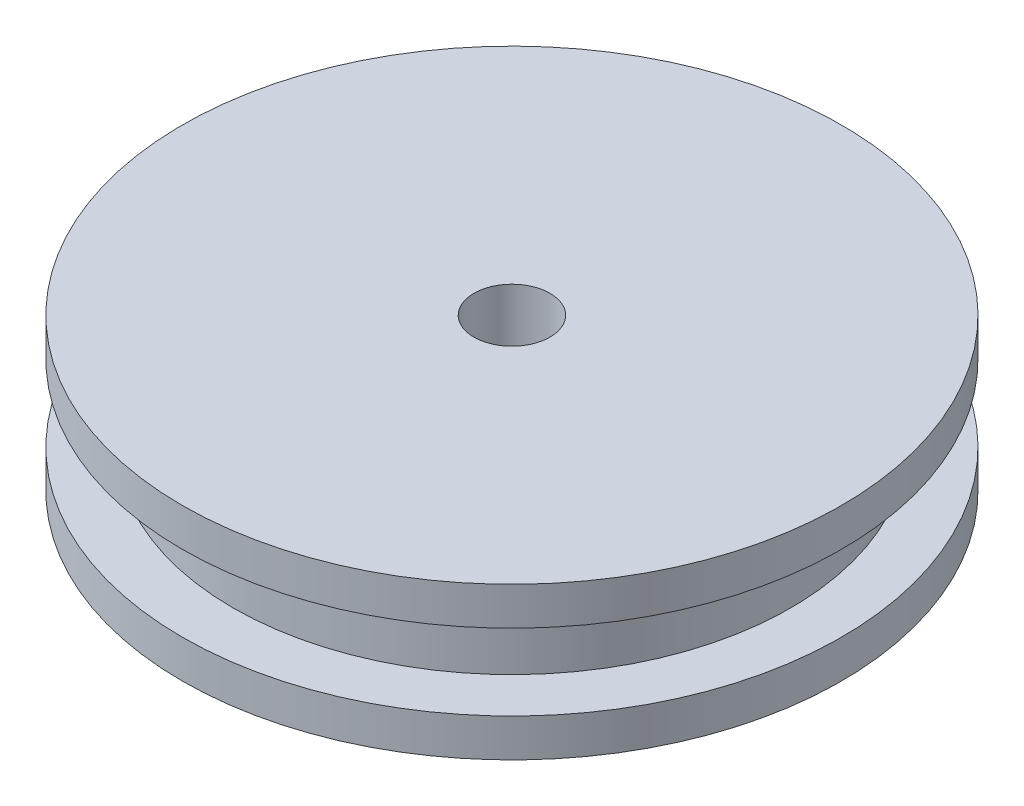
ISO-10303-21;
HEADER;
FILE_DESCRIPTION(('STEP AP214'),'2;1');
FILE_NAME('part.step','',(''),(''),'','','');
FILE_SCHEMA(('AUTOMOTIVE_DESIGN { 1 0 10303 214 1 1 1 1 }'));
ENDSEC;
DATA;
#1=APPLICATION_CONTEXT('core data for automotive mechanical design processes');
#2=APPLICATION_PROTOCOL_DEFINITION('international standard','automotive_design',2000,#1);
#3=PRODUCT_CONTEXT('',#1,'mechanical');
#4=PRODUCT('Part','Part','',(#3));
#5=PRODUCT_RELATED_PRODUCT_CATEGORY('part','',(#4));
#6=PRODUCT_DEFINITION_FORMATION('','',#4);
#7=PRODUCT_DEFINITION_CONTEXT('part definition',#1,'design');
#8=PRODUCT_DEFINITION('design','',#6,#7);
#9=PRODUCT_DEFINITION_SHAPE('','',#8);
#10=(LENGTH_UNIT() NAMED_UNIT(*) SI_UNIT(.MILLI.,.METRE.));
#11=(NAMED_UNIT(*) PLANE_ANGLE_UNIT() SI_UNIT($,.RADIAN.));
#12=(NAMED_UNIT(*) SI_UNIT($,.STERADIAN.) SOLID_ANGLE_UNIT());
#13=UNCERTAINTY_MEASURE_WITH_UNIT(LENGTH_MEASURE(1.E-05),#10,'distance_accuracy_value','');
#14=(GEOMETRIC_REPRESENTATION_CONTEXT(3) GLOBAL_UNCERTAINTY_ASSIGNED_CONTEXT((#13)) GLOBAL_UNIT_ASSIGNED_CONTEXT((#10,
#11,#12)) REPRESENTATION_CONTEXT('',''));
#15=CARTESIAN_POINT('',(0.,0.,0.));
#16=DIRECTION('',(0.,0.,1.));
#17=DIRECTION('',(1.,0.,0.));
#18=AXIS2_PLACEMENT_3D('',#15,#16,#17);
#19=CARTESIAN_POINT('',(0.,16.6116202090912,0.));
#20=DIRECTION('',(0.,1.,0.));
#21=DIRECTION('',(0.,0.,1.));
#22=AXIS2_PLACEMENT_3D('',#19,#20,#21);
#23=PLANE('',#22);
#24=CARTESIAN_POINT('',(0.,16.6116202090912,0.));
#25=DIRECTION('',(0.,1.,0.));
#26=DIRECTION('',(0.,0.,1.));
#27=AXIS2_PLACEMENT_3D('',#24,#25,#26);
#28=CIRCLE('',#27,9.525);
#29=CARTESIAN_POINT('',(0.,16.6116202090912,9.525));
#30=VERTEX_POINT('',#29);
#31=EDGE_CURVE('E59',#30,#30,#28,.T.);
#32=ORIENTED_EDGE('',*,*,#31,.F.);
#33=EDGE_LOOP('',(#32));
#34=FACE_BOUND('',#33,.T.);
#35=CARTESIAN_POINT('',(0.,16.6116202090912,0.));
#36=DIRECTION('',(0.,1.,0.));
#37=DIRECTION('',(0.,0.,1.));
#38=AXIS2_PLACEMENT_3D('',#35,#36,#37);
#39=CIRCLE('',#38,82.55);
#40=CARTESIAN_POINT('',(0.,16.6116202090912,82.55));
#41=VERTEX_POINT('',#40);
#42=EDGE_CURVE('E10',#41,#41,#39,.T.);
#43=ORIENTED_EDGE('',*,*,#42,.T.);
#44=EDGE_LOOP('',(#43));
#45=FACE_BOUND('',#44,.T.);
#46=ADVANCED_FACE('F33',(#34,#45),#23,.T.);
#47=CARTESIAN_POINT('',(0.,36.5649399399399,0.));
#48=DIRECTION('',(0.,1.,0.));
#49=DIRECTION('',(0.,0.,1.));
#50=AXIS2_PLACEMENT_3D('',#47,#48,#49);
#51=CYLINDRICAL_SURFACE('',#50,82.55);
#52=CARTESIAN_POINT('',(0.,7.0866202090912,0.));
#53=DIRECTION('',(0.,1.,0.));
#54=DIRECTION('',(0.,0.,1.));
#55=AXIS2_PLACEMENT_3D('',#52,#53,#54);
#56=CIRCLE('',#55,82.55);
#57=CARTESIAN_POINT('',(0.,7.0866202090912,82.55));
#58=VERTEX_POINT('',#57);
#59=EDGE_CURVE('E39',#58,#58,#56,.T.);
#60=ORIENTED_EDGE('',*,*,#59,.T.);
#61=EDGE_LOOP('',(#60));
#62=FACE_BOUND('',#61,.T.);
#63=ORIENTED_EDGE('',*,*,#42,.F.);
#64=EDGE_LOOP('',(#63));
#65=FACE_BOUND('',#64,.T.);
#66=ADVANCED_FACE('F75',(#62,#65),#51,.T.);
#67=CARTESIAN_POINT('',(-82.55,7.0866202090912,0.));
#68=DIRECTION('',(0.,-1.,0.));
#69=DIRECTION('',(0.,0.,-1.));
#70=AXIS2_PLACEMENT_3D('',#67,#68,#69);
#71=PLANE('',#70);
#72=CARTESIAN_POINT('',(0.,7.0866202090912,0.));
#73=DIRECTION('',(0.,1.,0.));
#74=DIRECTION('',(0.,0.,1.));
#75=AXIS2_PLACEMENT_3D('',#72,#73,#74);
#76=CIRCLE('',#75,69.85);
#77=CARTESIAN_POINT('',(0.,7.0866202090912,69.85));
#78=VERTEX_POINT('',#77);
#79=EDGE_CURVE('E43',#78,#78,#76,.T.);
#80=ORIENTED_EDGE('',*,*,#79,.T.);
#81=EDGE_LOOP('',(#80));
#82=FACE_BOUND('',#81,.T.);
#83=ORIENTED_EDGE('',*,*,#59,.F.);
#84=EDGE_LOOP('',(#83));
#85=FACE_BOUND('',#84,.T.);
#86=ADVANCED_FACE('F79',(#82,#85),#71,.T.);
#87=CARTESIAN_POINT('',(0.,36.5649399399399,0.));
#88=DIRECTION('',(0.,1.,0.));
#89=DIRECTION('',(0.,0.,1.));
#90=AXIS2_PLACEMENT_3D('',#87,#88,#89);
#91=CYLINDRICAL_SURFACE('',#90,69.85);
#92=CARTESIAN_POINT('',(0.,-11.9633797909088,0.));
#93=DIRECTION('',(0.,1.,0.));
#94=DIRECTION('',(0.,0.,1.));
#95=AXIS2_PLACEMENT_3D('',#92,#93,#94);
#96=CIRCLE('',#95,69.85);
#97=CARTESIAN_POINT('',(0.,-11.9633797909088,69.85));
#98=VERTEX_POINT('',#97);
#99=EDGE_CURVE('E47',#98,#98,#96,.T.);
#100=ORIENTED_EDGE('',*,*,#99,.T.);
#101=EDGE_LOOP('',(#100));
#102=FACE_BOUND('',#101,.T.);
#103=ORIENTED_EDGE('',*,*,#79,.F.);
#104=EDGE_LOOP('',(#103));
#105=FACE_BOUND('',#104,.T.);
#106=ADVANCED_FACE('F83',(#102,#105),#91,.T.);
#107=CARTESIAN_POINT('',(-69.85,-11.9633797909088,0.));
#108=DIRECTION('',(0.,1.,0.));
#109=DIRECTION('',(0.,0.,1.));
#110=AXIS2_PLACEMENT_3D('',#107,#108,#109);
#111=PLANE('',#110);
#112=CARTESIAN_POINT('',(0.,-11.9633797909088,0.));
#113=DIRECTION('',(0.,1.,0.));
#114=DIRECTION('',(0.,0.,1.));
#115=AXIS2_PLACEMENT_3D('',#112,#113,#114);
#116=CIRCLE('',#115,82.55);
#117=CARTESIAN_POINT('',(0.,-11.9633797909088,82.55));
#118=VERTEX_POINT('',#117);
#119=EDGE_CURVE('E52',#118,#118,#116,.T.);
#120=ORIENTED_EDGE('',*,*,#119,.T.);
#121=EDGE_LOOP('',(#120));
#122=FACE_BOUND('',#121,.T.);
#123=ORIENTED_EDGE('',*,*,#99,.F.);
#124=EDGE_LOOP('',(#123));
#125=FACE_BOUND('',#124,.T.);
#126=ADVANCED_FACE('F90',(#122,#125),#111,.T.);
#127=CARTESIAN_POINT('',(0.,36.5649399399399,0.));
#128=DIRECTION('',(0.,1.,0.));
#129=DIRECTION('',(0.,0.,1.));
#130=AXIS2_PLACEMENT_3D('',#127,#128,#129);
#131=CYLINDRICAL_SURFACE('',#130,82.55);
#132=CARTESIAN_POINT('',(0.,-21.4883797909088,0.));
#133=DIRECTION('',(0.,1.,0.));
#134=DIRECTION('',(0.,0.,1.));
#135=AXIS2_PLACEMENT_3D('',#132,#133,#134);
#136=CIRCLE('',#135,82.55);
#137=CARTESIAN_POINT('',(0.,-21.4883797909088,82.55));
#138=VERTEX_POINT('',#137);
#139=EDGE_CURVE('E55',#138,#138,#136,.T.);
#140=ORIENTED_EDGE('',*,*,#139,.T.);
#141=EDGE_LOOP('',(#140));
#142=FACE_BOUND('',#141,.T.);
#143=ORIENTED_EDGE('',*,*,#119,.F.);
#144=EDGE_LOOP('',(#143));
#145=FACE_BOUND('',#144,.T.);
#146=ADVANCED_FACE('F94',(#142,#145),#131,.T.);
#147=CARTESIAN_POINT('',(-82.55,-21.4883797909088,0.));
#148=DIRECTION('',(0.,-1.,0.));
#149=DIRECTION('',(0.,0.,-1.));
#150=AXIS2_PLACEMENT_3D('',#147,#148,#149);
#151=PLANE('',#150);
#152=CARTESIAN_POINT('',(0.,-21.4883797909088,0.));
#153=DIRECTION('',(0.,1.,0.));
#154=DIRECTION('',(0.,0.,1.));
#155=AXIS2_PLACEMENT_3D('',#152,#153,#154);
#156=CIRCLE('',#155,9.525);
#157=CARTESIAN_POINT('',(0.,-21.4883797909088,9.525));
#158=VERTEX_POINT('',#157);
#159=EDGE_CURVE('E58',#158,#158,#156,.T.);
#160=ORIENTED_EDGE('',*,*,#159,.T.);
#161=EDGE_LOOP('',(#160));
#162=FACE_BOUND('',#161,.T.);
#163=ORIENTED_EDGE('',*,*,#139,.F.);
#164=EDGE_LOOP('',(#163));
#165=FACE_BOUND('',#164,.T.);
#166=ADVANCED_FACE('F65',(#162,#165),#151,.T.);
#167=CARTESIAN_POINT('',(0.,-21.4883797909088,0.));
#168=DIRECTION('',(0.,1.,0.));
#169=DIRECTION('',(0.,0.,1.));
#170=AXIS2_PLACEMENT_3D('',#167,#168,#169);
#171=CYLINDRICAL_SURFACE('',#170,9.525);
#172=ORIENTED_EDGE('',*,*,#159,.F.);
#173=EDGE_LOOP('',(#172));
#174=FACE_BOUND('',#173,.T.);
#175=ORIENTED_EDGE('',*,*,#31,.T.);
#176=EDGE_LOOP('',(#175));
#177=FACE_BOUND('',#176,.T.);
#178=ADVANCED_FACE('F68',(#174,#177),#171,.F.);
#179=CLOSED_SHELL('',(#46,#66,#86,#106,#126,#146,#166,#178));
#180=MANIFOLD_SOLID_BREP('B2',#179);
#181=ADVANCED_BREP_SHAPE_REPRESENTATION('',(#18,#180),#14);
#182=SHAPE_DEFINITION_REPRESENTATION(#9,#181);
ENDSEC;
END-ISO-10303-21;
